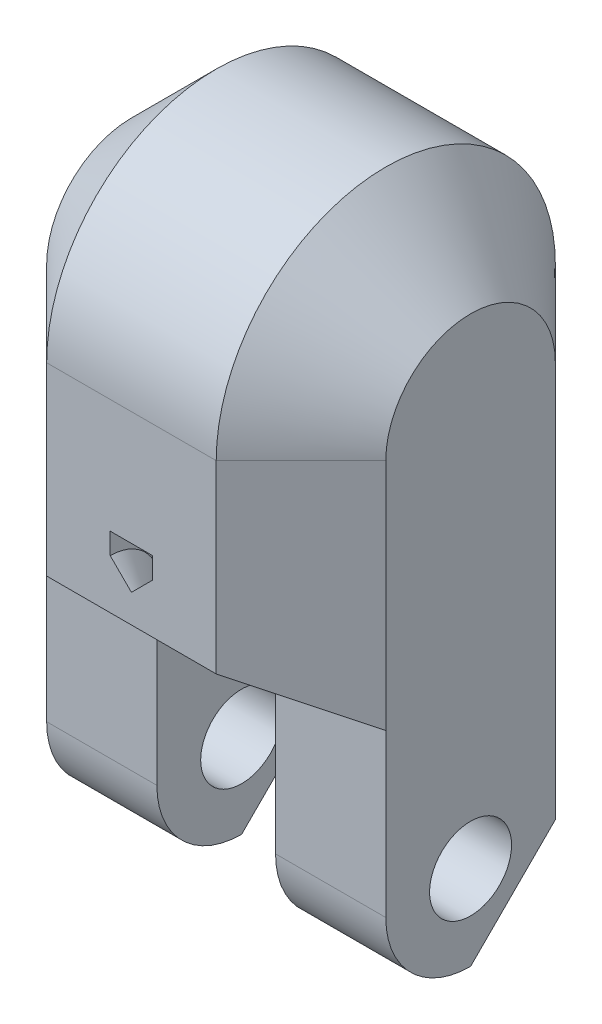
ISO-10303-21;
HEADER;
FILE_DESCRIPTION(('STEP AP214'),'2;1');
FILE_NAME('part.step','',(''),(''),'','','');
FILE_SCHEMA(('AUTOMOTIVE_DESIGN { 1 0 10303 214 1 1 1 1 }'));
ENDSEC;
DATA;
#1=APPLICATION_CONTEXT('core data for automotive mechanical design processes');
#2=APPLICATION_PROTOCOL_DEFINITION('international standard','automotive_design',2000,#1);
#3=PRODUCT_CONTEXT('',#1,'mechanical');
#4=PRODUCT('Part','Part','',(#3));
#5=PRODUCT_RELATED_PRODUCT_CATEGORY('part','',(#4));
#6=PRODUCT_DEFINITION_FORMATION('','',#4);
#7=PRODUCT_DEFINITION_CONTEXT('part definition',#1,'design');
#8=PRODUCT_DEFINITION('design','',#6,#7);
#9=PRODUCT_DEFINITION_SHAPE('','',#8);
#10=(LENGTH_UNIT() NAMED_UNIT(*) SI_UNIT(.MILLI.,.METRE.));
#11=(NAMED_UNIT(*) PLANE_ANGLE_UNIT() SI_UNIT($,.RADIAN.));
#12=(NAMED_UNIT(*) SI_UNIT($,.STERADIAN.) SOLID_ANGLE_UNIT());
#13=UNCERTAINTY_MEASURE_WITH_UNIT(LENGTH_MEASURE(1.E-05),#10,'distance_accuracy_value','');
#14=(GEOMETRIC_REPRESENTATION_CONTEXT(3) GLOBAL_UNCERTAINTY_ASSIGNED_CONTEXT((#13)) GLOBAL_UNIT_ASSIGNED_CONTEXT((#10,
#11,#12)) REPRESENTATION_CONTEXT('',''));
#15=CARTESIAN_POINT('',(0.,0.,0.));
#16=DIRECTION('',(0.,0.,1.));
#17=DIRECTION('',(1.,0.,0.));
#18=AXIS2_PLACEMENT_3D('',#15,#16,#17);
#19=CARTESIAN_POINT('',(-3.,5.,-6.));
#20=DIRECTION('',(0.,0.,-1.));
#21=DIRECTION('',(-1.,0.,0.));
#22=AXIS2_PLACEMENT_3D('',#19,#20,#21);
#23=PLANE('',#22);
#24=DIRECTION('',(0.,-1.,0.));
#25=VECTOR('',#24,1.);
#26=CARTESIAN_POINT('',(3.,5.,-6.));
#27=LINE('',#26,#25);
#28=CARTESIAN_POINT('',(3.,5.,-6.));
#29=VERTEX_POINT('',#28);
#30=CARTESIAN_POINT('',(3.,-8.7,-6.));
#31=VERTEX_POINT('',#30);
#32=EDGE_CURVE('E382',#29,#31,#27,.T.);
#33=ORIENTED_EDGE('',*,*,#32,.T.);
#34=DIRECTION('',(1.,0.,0.));
#35=VECTOR('',#34,1.);
#36=CARTESIAN_POINT('',(3.,-8.7,-6.));
#37=LINE('',#36,#35);
#38=CARTESIAN_POINT('',(-3.,-8.7,-6.));
#39=VERTEX_POINT('',#38);
#40=EDGE_CURVE('E488',#39,#31,#37,.T.);
#41=ORIENTED_EDGE('',*,*,#40,.F.);
#42=DIRECTION('',(0.,-1.,0.));
#43=VECTOR('',#42,1.);
#44=CARTESIAN_POINT('',(-3.,5.,-6.));
#45=LINE('',#44,#43);
#46=CARTESIAN_POINT('',(-3.,5.,-6.));
#47=VERTEX_POINT('',#46);
#48=EDGE_CURVE('E385',#47,#39,#45,.T.);
#49=ORIENTED_EDGE('',*,*,#48,.F.);
#50=DIRECTION('',(1.,0.,0.));
#51=VECTOR('',#50,1.);
#52=CARTESIAN_POINT('',(-3.,5.,-6.));
#53=LINE('',#52,#51);
#54=EDGE_CURVE('E343',#47,#29,#53,.T.);
#55=ORIENTED_EDGE('',*,*,#54,.T.);
#56=EDGE_LOOP('',(#33,#41,#49,#55));
#57=FACE_BOUND('',#56,.T.);
#58=DIRECTION('',(0.,1.,0.));
#59=VECTOR('',#58,1.);
#60=CARTESIAN_POINT('',(0.75,5.,-6.));
#61=LINE('',#60,#59);
#62=CARTESIAN_POINT('',(0.749999999999999,-7.7,-6.));
#63=VERTEX_POINT('',#62);
#64=CARTESIAN_POINT('',(0.75,-6.95,-6.));
#65=VERTEX_POINT('',#64);
#66=EDGE_CURVE('E461',#63,#65,#61,.T.);
#67=ORIENTED_EDGE('',*,*,#66,.T.);
#68=DIRECTION('',(0.707106781186548,-0.707106781186547,0.));
#69=VECTOR('',#68,1.);
#70=CARTESIAN_POINT('',(2.5,-8.7,-6.));
#71=LINE('',#70,#69);
#72=CARTESIAN_POINT('',(0.,-6.2,-6.));
#73=VERTEX_POINT('',#72);
#74=EDGE_CURVE('E479',#65,#73,#71,.F.);
#75=ORIENTED_EDGE('',*,*,#74,.T.);
#76=DIRECTION('',(0.707106781186547,0.707106781186548,0.));
#77=VECTOR('',#76,1.);
#78=CARTESIAN_POINT('',(-2.5,-8.7,-6.));
#79=LINE('',#78,#77);
#80=CARTESIAN_POINT('',(-0.75,-6.95,-6.));
#81=VERTEX_POINT('',#80);
#82=EDGE_CURVE('E476',#73,#81,#79,.F.);
#83=ORIENTED_EDGE('',*,*,#82,.T.);
#84=DIRECTION('',(0.,-1.,0.));
#85=VECTOR('',#84,1.);
#86=CARTESIAN_POINT('',(-0.75,5.,-6.));
#87=LINE('',#86,#85);
#88=CARTESIAN_POINT('',(-0.750000000000001,-7.7,-6.));
#89=VERTEX_POINT('',#88);
#90=EDGE_CURVE('E455',#81,#89,#87,.T.);
#91=ORIENTED_EDGE('',*,*,#90,.T.);
#92=DIRECTION('',(-1.,0.,0.));
#93=VECTOR('',#92,1.);
#94=CARTESIAN_POINT('',(-3.,-7.7,-6.));
#95=LINE('',#94,#93);
#96=EDGE_CURVE('E470',#89,#63,#95,.F.);
#97=ORIENTED_EDGE('',*,*,#96,.T.);
#98=EDGE_LOOP('',(#67,#75,#83,#91,#97));
#99=FACE_BOUND('',#98,.T.);
#100=ADVANCED_FACE('F38',(#57,#99),#23,.T.);
#101=CARTESIAN_POINT('',(0.,-8.7,0.));
#102=DIRECTION('',(0.,-1.,0.));
#103=DIRECTION('',(0.,0.,-1.));
#104=AXIS2_PLACEMENT_3D('',#101,#102,#103);
#105=PLANE('',#104);
#106=DIRECTION('',(0.707106781186548,0.,-0.707106781186548));
#107=VECTOR('',#106,1.);
#108=CARTESIAN_POINT('',(-3.,-8.7,-6.));
#109=LINE('',#108,#107);
#110=CARTESIAN_POINT('',(-6.,-8.7,-3.));
#111=VERTEX_POINT('',#110);
#112=EDGE_CURVE('E484',#111,#39,#109,.T.);
#113=ORIENTED_EDGE('',*,*,#112,.T.);
#114=ORIENTED_EDGE('',*,*,#40,.T.);
#115=DIRECTION('',(0.707106781186548,0.,0.707106781186548));
#116=VECTOR('',#115,1.);
#117=CARTESIAN_POINT('',(6.,-8.7,-3.));
#118=LINE('',#117,#116);
#119=CARTESIAN_POINT('',(6.,-8.7,-3.));
#120=VERTEX_POINT('',#119);
#121=EDGE_CURVE('E492',#31,#120,#118,.T.);
#122=ORIENTED_EDGE('',*,*,#121,.T.);
#123=DIRECTION('',(-1.,0.,0.));
#124=VECTOR('',#123,1.);
#125=CARTESIAN_POINT('',(2.1,-8.7,-3.));
#126=LINE('',#125,#124);
#127=CARTESIAN_POINT('',(2.1,-8.7,-3.));
#128=VERTEX_POINT('',#127);
#129=EDGE_CURVE('E248',#120,#128,#126,.T.);
#130=ORIENTED_EDGE('',*,*,#129,.T.);
#131=CARTESIAN_POINT('',(-2.1,-8.7,-3.));
#132=VERTEX_POINT('',#131);
#133=EDGE_CURVE('E499',#128,#132,#126,.T.);
#134=ORIENTED_EDGE('',*,*,#133,.T.);
#135=EDGE_CURVE('E495',#132,#111,#126,.T.);
#136=ORIENTED_EDGE('',*,*,#135,.T.);
#137=EDGE_LOOP('',(#113,#114,#122,#130,#134,#136));
#138=FACE_BOUND('',#137,.T.);
#139=DIRECTION('',(-0.707106781186547,0.,-0.707106781186548));
#140=VECTOR('',#139,1.);
#141=CARTESIAN_POINT('',(-2.5,-8.7,-6.));
#142=LINE('',#141,#140);
#143=CARTESIAN_POINT('',(-0.75,-8.7,-4.25));
#144=VERTEX_POINT('',#143);
#145=CARTESIAN_POINT('',(0.,-8.7,-3.5));
#146=VERTEX_POINT('',#145);
#147=EDGE_CURVE('E47',#144,#146,#142,.F.);
#148=ORIENTED_EDGE('',*,*,#147,.T.);
#149=DIRECTION('',(-0.707106781186548,0.,0.707106781186547));
#150=VECTOR('',#149,1.);
#151=CARTESIAN_POINT('',(2.5,-8.7,-6.));
#152=LINE('',#151,#150);
#153=CARTESIAN_POINT('',(0.75,-8.7,-4.25));
#154=VERTEX_POINT('',#153);
#155=EDGE_CURVE('E11',#146,#154,#152,.F.);
#156=ORIENTED_EDGE('',*,*,#155,.T.);
#157=DIRECTION('',(0.,0.,-1.));
#158=VECTOR('',#157,1.);
#159=CARTESIAN_POINT('',(0.75,-8.7,0.));
#160=LINE('',#159,#158);
#161=CARTESIAN_POINT('',(0.749999999999999,-8.7,-5.));
#162=VERTEX_POINT('',#161);
#163=EDGE_CURVE('E426',#154,#162,#160,.T.);
#164=ORIENTED_EDGE('',*,*,#163,.T.);
#165=DIRECTION('',(-1.,0.,0.));
#166=VECTOR('',#165,1.);
#167=CARTESIAN_POINT('',(-3.,-8.7,-5.));
#168=LINE('',#167,#166);
#169=CARTESIAN_POINT('',(-0.750000000000001,-8.7,-5.));
#170=VERTEX_POINT('',#169);
#171=EDGE_CURVE('E430',#162,#170,#168,.T.);
#172=ORIENTED_EDGE('',*,*,#171,.T.);
#173=DIRECTION('',(0.,0.,1.));
#174=VECTOR('',#173,1.);
#175=CARTESIAN_POINT('',(-0.75,-8.7,0.));
#176=LINE('',#175,#174);
#177=EDGE_CURVE('E434',#170,#144,#176,.T.);
#178=ORIENTED_EDGE('',*,*,#177,.T.);
#179=EDGE_LOOP('',(#148,#156,#164,#172,#178));
#180=FACE_BOUND('',#179,.T.);
#181=ADVANCED_FACE('F440',(#138,#180),#105,.T.);
#182=CARTESIAN_POINT('',(0.,-5.,0.));
#183=DIRECTION('',(0.,-1.,0.));
#184=DIRECTION('',(0.,0.,-1.));
#185=AXIS2_PLACEMENT_3D('',#182,#183,#184);
#186=PLANE('',#185);
#187=DIRECTION('',(0.,0.,-1.));
#188=VECTOR('',#187,1.);
#189=CARTESIAN_POINT('',(-2.1,-5.,0.));
#190=LINE('',#189,#188);
#191=CARTESIAN_POINT('',(-2.1,-5.,0.));
#192=VERTEX_POINT('',#191);
#193=CARTESIAN_POINT('',(-2.1,-5.,-3.));
#194=VERTEX_POINT('',#193);
#195=EDGE_CURVE('E308',#192,#194,#190,.T.);
#196=ORIENTED_EDGE('',*,*,#195,.T.);
#197=DIRECTION('',(-1.,0.,0.));
#198=VECTOR('',#197,1.);
#199=CARTESIAN_POINT('',(-6.,-5.,-3.));
#200=LINE('',#199,#198);
#201=CARTESIAN_POINT('',(2.1,-5.,-3.));
#202=VERTEX_POINT('',#201);
#203=EDGE_CURVE('E483',#202,#194,#200,.T.);
#204=ORIENTED_EDGE('',*,*,#203,.F.);
#205=DIRECTION('',(0.,0.,-1.));
#206=VECTOR('',#205,1.);
#207=CARTESIAN_POINT('',(2.1,-5.,0.));
#208=LINE('',#207,#206);
#209=CARTESIAN_POINT('',(2.1,-5.,0.));
#210=VERTEX_POINT('',#209);
#211=EDGE_CURVE('E270',#210,#202,#208,.T.);
#212=ORIENTED_EDGE('',*,*,#211,.F.);
#213=DIRECTION('',(1.,0.,0.));
#214=VECTOR('',#213,1.);
#215=CARTESIAN_POINT('',(-6.,-5.,0.));
#216=LINE('',#215,#214);
#217=EDGE_CURVE('E325',#192,#210,#216,.T.);
#218=ORIENTED_EDGE('',*,*,#217,.F.);
#219=EDGE_LOOP('',(#196,#204,#212,#218));
#220=FACE_BOUND('',#219,.T.);
#221=ADVANCED_FACE('F599',(#220),#186,.T.);
#222=CARTESIAN_POINT('',(-6.,-1.53589838486229,6.));
#223=DIRECTION('',(0.,0.866025403784442,-0.499999999999995));
#224=DIRECTION('',(0.,0.499999999999995,0.866025403784442));
#225=AXIS2_PLACEMENT_3D('',#222,#223,#224);
#226=PLANE('',#225);
#227=DIRECTION('',(-0.707106781186541,-0.353553390593273,-0.612372435695802));
#228=VECTOR('',#227,1.);
#229=CARTESIAN_POINT('',(0.999999999999979,-1.53589838486229,6.));
#230=LINE('',#229,#228);
#231=CARTESIAN_POINT('',(-0.749999999999986,-2.41089838486228,4.48445554337723));
#232=VERTEX_POINT('',#231);
#233=CARTESIAN_POINT('',(0.,-2.03589838486229,5.13397459621556));
#234=VERTEX_POINT('',#233);
#235=EDGE_CURVE('E537',#232,#234,#230,.F.);
#236=ORIENTED_EDGE('',*,*,#235,.T.);
#237=DIRECTION('',(-0.707106781186554,0.353553390593267,0.612372435695791));
#238=VECTOR('',#237,1.);
#239=CARTESIAN_POINT('',(-1.00000000000002,-1.53589838486229,6.));
#240=LINE('',#239,#238);
#241=CARTESIAN_POINT('',(0.750000000000014,-2.41089838486228,4.48445554337723));
#242=VERTEX_POINT('',#241);
#243=EDGE_CURVE('E410',#234,#242,#240,.F.);
#244=ORIENTED_EDGE('',*,*,#243,.T.);
#245=DIRECTION('',(0.,-0.499999999999995,-0.866025403784442));
#246=VECTOR('',#245,1.);
#247=CARTESIAN_POINT('',(0.750000000000014,-1.53589838486229,6.));
#248=LINE('',#247,#246);
#249=CARTESIAN_POINT('',(0.750000000000014,-2.78589838486228,3.8349364905389));
#250=VERTEX_POINT('',#249);
#251=EDGE_CURVE('E525',#242,#250,#248,.T.);
#252=ORIENTED_EDGE('',*,*,#251,.T.);
#253=DIRECTION('',(-1.,0.,0.));
#254=VECTOR('',#253,1.);
#255=CARTESIAN_POINT('',(-3.,-2.78589838486228,3.8349364905389));
#256=LINE('',#255,#254);
#257=CARTESIAN_POINT('',(-0.749999999999986,-2.78589838486228,3.8349364905389));
#258=VERTEX_POINT('',#257);
#259=EDGE_CURVE('E529',#250,#258,#256,.T.);
#260=ORIENTED_EDGE('',*,*,#259,.T.);
#261=DIRECTION('',(0.,0.499999999999995,0.866025403784442));
#262=VECTOR('',#261,1.);
#263=CARTESIAN_POINT('',(-0.749999999999986,-1.53589838486229,6.));
#264=LINE('',#263,#262);
#265=EDGE_CURVE('E533',#258,#232,#264,.T.);
#266=ORIENTED_EDGE('',*,*,#265,.T.);
#267=EDGE_LOOP('',(#236,#244,#252,#260,#266));
#268=FACE_BOUND('',#267,.T.);
#269=DIRECTION('',(0.,0.499999999999995,0.866025403784442));
#270=VECTOR('',#269,1.);
#271=CARTESIAN_POINT('',(2.1,-1.53589838486229,6.));
#272=LINE('',#271,#270);
#273=CARTESIAN_POINT('',(2.1,-3.26794919243115,3.));
#274=VERTEX_POINT('',#273);
#275=EDGE_CURVE('E397',#210,#274,#272,.T.);
#276=ORIENTED_EDGE('',*,*,#275,.T.);
#277=DIRECTION('',(1.,0.,0.));
#278=VECTOR('',#277,1.);
#279=CARTESIAN_POINT('',(-6.,-3.26794919243115,3.));
#280=LINE('',#279,#278);
#281=CARTESIAN_POINT('',(6.,-3.26794919243115,3.));
#282=VERTEX_POINT('',#281);
#283=EDGE_CURVE('E266',#274,#282,#280,.T.);
#284=ORIENTED_EDGE('',*,*,#283,.T.);
#285=DIRECTION('',(-0.654653670707978,0.377964473009223,0.654653670707978));
#286=VECTOR('',#285,1.);
#287=CARTESIAN_POINT('',(3.95421313204448,-2.08681359351244,5.04578686795552));
#288=LINE('',#287,#286);
#289=CARTESIAN_POINT('',(3.,-1.53589838486229,6.));
#290=VERTEX_POINT('',#289);
#291=EDGE_CURVE('E329',#282,#290,#288,.T.);
#292=ORIENTED_EDGE('',*,*,#291,.T.);
#293=DIRECTION('',(1.,0.,0.));
#294=VECTOR('',#293,1.);
#295=CARTESIAN_POINT('',(-6.,-1.53589838486229,6.));
#296=LINE('',#295,#294);
#297=CARTESIAN_POINT('',(-3.,-1.53589838486229,6.));
#298=VERTEX_POINT('',#297);
#299=EDGE_CURVE('E324',#298,#290,#296,.T.);
#300=ORIENTED_EDGE('',*,*,#299,.F.);
#301=DIRECTION('',(-0.654653670707978,-0.377964473009223,-0.654653670707979));
#302=VECTOR('',#301,1.);
#303=CARTESIAN_POINT('',(-1.38278456061589,-0.602198615596274,7.61721543938411));
#304=LINE('',#303,#302);
#305=CARTESIAN_POINT('',(-6.,-3.26794919243115,3.));
#306=VERTEX_POINT('',#305);
#307=EDGE_CURVE('E335',#298,#306,#304,.T.);
#308=ORIENTED_EDGE('',*,*,#307,.T.);
#309=DIRECTION('',(-1.,0.,0.));
#310=VECTOR('',#309,1.);
#311=CARTESIAN_POINT('',(-6.,-3.26794919243115,3.));
#312=LINE('',#311,#310);
#313=CARTESIAN_POINT('',(-2.1,-3.26794919243115,3.));
#314=VERTEX_POINT('',#313);
#315=EDGE_CURVE('E367',#314,#306,#312,.T.);
#316=ORIENTED_EDGE('',*,*,#315,.F.);
#317=DIRECTION('',(0.,0.499999999999995,0.866025403784442));
#318=VECTOR('',#317,1.);
#319=CARTESIAN_POINT('',(-2.1,-1.53589838486229,6.));
#320=LINE('',#319,#318);
#321=EDGE_CURVE('E393',#192,#314,#320,.T.);
#322=ORIENTED_EDGE('',*,*,#321,.F.);
#323=ORIENTED_EDGE('',*,*,#217,.T.);
#324=EDGE_LOOP('',(#276,#284,#292,#300,#308,#316,#322,#323));
#325=FACE_BOUND('',#324,.T.);
#326=ADVANCED_FACE('F569',(#268,#325),#226,.F.);
#327=CARTESIAN_POINT('',(-6.,5.,3.));
#328=DIRECTION('',(-1.,0.,0.));
#329=DIRECTION('',(0.,0.,1.));
#330=AXIS2_PLACEMENT_3D('',#327,#328,#329);
#331=PLANE('',#330);
#332=DIRECTION('',(0.,0.70710678118655,-0.707106781186545));
#333=VECTOR('',#332,1.);
#334=CARTESIAN_POINT('',(-6.,-4.99999999999994,-7.00000000000001));
#335=LINE('',#334,#333);
#336=CARTESIAN_POINT('',(-6.,-12.,0.));
#337=VERTEX_POINT('',#336);
#338=CARTESIAN_POINT('',(-6.,-8.99999999999998,-3.));
#339=VERTEX_POINT('',#338);
#340=EDGE_CURVE('E589',#337,#339,#335,.T.);
#341=ORIENTED_EDGE('',*,*,#340,.F.);
#342=CARTESIAN_POINT('',(-6.,-9.,0.));
#343=DIRECTION('',(-1.,0.,0.));
#344=DIRECTION('',(0.,0.,1.));
#345=AXIS2_PLACEMENT_3D('',#342,#343,#344);
#346=CIRCLE('',#345,3.);
#347=CARTESIAN_POINT('',(-6.,-9.,3.));
#348=VERTEX_POINT('',#347);
#349=EDGE_CURVE('E279',#337,#348,#346,.T.);
#350=ORIENTED_EDGE('',*,*,#349,.T.);
#351=DIRECTION('',(0.,1.,0.));
#352=VECTOR('',#351,1.);
#353=CARTESIAN_POINT('',(-6.,-9.,3.));
#354=LINE('',#353,#352);
#355=EDGE_CURVE('E292',#348,#306,#354,.T.);
#356=ORIENTED_EDGE('',*,*,#355,.T.);
#357=DIRECTION('',(0.,-1.,0.));
#358=VECTOR('',#357,1.);
#359=CARTESIAN_POINT('',(-6.,5.,3.));
#360=LINE('',#359,#358);
#361=CARTESIAN_POINT('',(-6.,4.99999999999998,3.));
#362=VERTEX_POINT('',#361);
#363=EDGE_CURVE('E364',#362,#306,#360,.T.);
#364=ORIENTED_EDGE('',*,*,#363,.F.);
#365=CARTESIAN_POINT('',(-6.,5.,0.));
#366=DIRECTION('',(-1.,0.,0.));
#367=DIRECTION('',(0.,0.,1.));
#368=AXIS2_PLACEMENT_3D('',#365,#366,#367);
#369=CIRCLE('',#368,3.);
#370=CARTESIAN_POINT('',(-6.,5.,-3.));
#371=VERTEX_POINT('',#370);
#372=EDGE_CURVE('E321',#362,#371,#369,.T.);
#373=ORIENTED_EDGE('',*,*,#372,.T.);
#374=DIRECTION('',(0.,-1.,0.));
#375=VECTOR('',#374,1.);
#376=CARTESIAN_POINT('',(-6.,5.,-3.));
#377=LINE('',#376,#375);
#378=EDGE_CURVE('E363',#371,#111,#377,.T.);
#379=ORIENTED_EDGE('',*,*,#378,.T.);
#380=DIRECTION('',(0.,1.,0.));
#381=VECTOR('',#380,1.);
#382=CARTESIAN_POINT('',(-6.,-9.,-3.));
#383=LINE('',#382,#381);
#384=EDGE_CURVE('E304',#339,#111,#383,.T.);
#385=ORIENTED_EDGE('',*,*,#384,.F.);
#386=EDGE_LOOP('',(#341,#350,#356,#364,#373,#379,#385));
#387=FACE_BOUND('',#386,.T.);
#388=CARTESIAN_POINT('',(-6.,-9.,0.));
#389=DIRECTION('',(-1.,0.,0.));
#390=DIRECTION('',(0.,0.,1.));
#391=AXIS2_PLACEMENT_3D('',#388,#389,#390);
#392=CIRCLE('',#391,1.45);
#393=CARTESIAN_POINT('',(-6.,-9.,1.45));
#394=VERTEX_POINT('',#393);
#395=EDGE_CURVE('E275',#394,#394,#392,.T.);
#396=ORIENTED_EDGE('',*,*,#395,.F.);
#397=EDGE_LOOP('',(#396));
#398=FACE_BOUND('',#397,.T.);
#399=ADVANCED_FACE('F40',(#387,#398),#331,.T.);
#400=CARTESIAN_POINT('',(-3.,5.,6.));
#401=DIRECTION('',(-0.707106781186548,0.,0.707106781186547));
#402=DIRECTION('',(0.707106781186547,0.,0.707106781186548));
#403=AXIS2_PLACEMENT_3D('',#400,#401,#402);
#404=PLANE('',#403);
#405=ORIENTED_EDGE('',*,*,#307,.F.);
#406=DIRECTION('',(0.,-1.,0.));
#407=VECTOR('',#406,1.);
#408=CARTESIAN_POINT('',(-3.,5.,6.));
#409=LINE('',#408,#407);
#410=CARTESIAN_POINT('',(-3.,4.99999999999996,6.));
#411=VERTEX_POINT('',#410);
#412=EDGE_CURVE('E368',#411,#298,#409,.T.);
#413=ORIENTED_EDGE('',*,*,#412,.F.);
#414=DIRECTION('',(-0.707106781186547,0.,-0.707106781186548));
#415=VECTOR('',#414,1.);
#416=CARTESIAN_POINT('',(-3.,5.,6.));
#417=LINE('',#416,#415);
#418=EDGE_CURVE('E359',#411,#362,#417,.T.);
#419=ORIENTED_EDGE('',*,*,#418,.T.);
#420=ORIENTED_EDGE('',*,*,#363,.T.);
#421=EDGE_LOOP('',(#405,#413,#419,#420));
#422=FACE_BOUND('',#421,.T.);
#423=ADVANCED_FACE('F576',(#422),#404,.T.);
#424=CARTESIAN_POINT('',(3.,5.,6.));
#425=DIRECTION('',(0.,0.,1.));
#426=DIRECTION('',(1.,0.,0.));
#427=AXIS2_PLACEMENT_3D('',#424,#425,#426);
#428=PLANE('',#427);
#429=DIRECTION('',(-0.707106781186554,-0.707106781186541,0.));
#430=VECTOR('',#429,1.);
#431=CARTESIAN_POINT('',(-1.00000000000002,-1.53589838486229,6.));
#432=LINE('',#431,#430);
#433=CARTESIAN_POINT('',(0.,-0.535898384862296,6.));
#434=VERTEX_POINT('',#433);
#435=CARTESIAN_POINT('',(0.750000000000014,0.214101615137704,6.));
#436=VERTEX_POINT('',#435);
#437=EDGE_CURVE('E422',#434,#436,#432,.F.);
#438=ORIENTED_EDGE('',*,*,#437,.F.);
#439=DIRECTION('',(-0.707106781186541,0.707106781186554,0.));
#440=VECTOR('',#439,1.);
#441=CARTESIAN_POINT('',(0.999999999999979,-1.53589838486229,6.));
#442=LINE('',#441,#440);
#443=CARTESIAN_POINT('',(-0.749999999999986,0.214101615137704,6.));
#444=VERTEX_POINT('',#443);
#445=EDGE_CURVE('E419',#444,#434,#442,.F.);
#446=ORIENTED_EDGE('',*,*,#445,.F.);
#447=DIRECTION('',(0.,-1.,0.));
#448=VECTOR('',#447,1.);
#449=CARTESIAN_POINT('',(-0.749999999999986,5.,6.));
#450=LINE('',#449,#448);
#451=CARTESIAN_POINT('',(-0.749999999999986,0.964101615137704,6.));
#452=VERTEX_POINT('',#451);
#453=EDGE_CURVE('E416',#452,#444,#450,.T.);
#454=ORIENTED_EDGE('',*,*,#453,.F.);
#455=DIRECTION('',(-1.,0.,0.));
#456=VECTOR('',#455,1.);
#457=CARTESIAN_POINT('',(-3.,0.964101615137704,6.));
#458=LINE('',#457,#456);
#459=CARTESIAN_POINT('',(0.750000000000014,0.964101615137704,6.));
#460=VERTEX_POINT('',#459);
#461=EDGE_CURVE('E413',#460,#452,#458,.T.);
#462=ORIENTED_EDGE('',*,*,#461,.F.);
#463=DIRECTION('',(0.,1.,0.));
#464=VECTOR('',#463,1.);
#465=CARTESIAN_POINT('',(0.750000000000014,5.,6.));
#466=LINE('',#465,#464);
#467=EDGE_CURVE('E404',#436,#460,#466,.T.);
#468=ORIENTED_EDGE('',*,*,#467,.F.);
#469=EDGE_LOOP('',(#438,#446,#454,#462,#468));
#470=FACE_BOUND('',#469,.T.);
#471=ORIENTED_EDGE('',*,*,#299,.T.);
#472=DIRECTION('',(0.,-1.,0.));
#473=VECTOR('',#472,1.);
#474=CARTESIAN_POINT('',(3.,5.,6.));
#475=LINE('',#474,#473);
#476=CARTESIAN_POINT('',(3.,4.99999999999996,6.));
#477=VERTEX_POINT('',#476);
#478=EDGE_CURVE('E372',#477,#290,#475,.T.);
#479=ORIENTED_EDGE('',*,*,#478,.F.);
#480=DIRECTION('',(-1.,0.,0.));
#481=VECTOR('',#480,1.);
#482=CARTESIAN_POINT('',(3.,5.,6.));
#483=LINE('',#482,#481);
#484=EDGE_CURVE('E355',#477,#411,#483,.T.);
#485=ORIENTED_EDGE('',*,*,#484,.T.);
#486=ORIENTED_EDGE('',*,*,#412,.T.);
#487=EDGE_LOOP('',(#471,#479,#485,#486));
#488=FACE_BOUND('',#487,.T.);
#489=ADVANCED_FACE('F572',(#470,#488),#428,.T.);
#490=CARTESIAN_POINT('',(6.,5.,3.));
#491=DIRECTION('',(0.707106781186548,0.,0.707106781186548));
#492=DIRECTION('',(0.707106781186548,0.,-0.707106781186548));
#493=AXIS2_PLACEMENT_3D('',#490,#491,#492);
#494=PLANE('',#493);
#495=ORIENTED_EDGE('',*,*,#291,.F.);
#496=DIRECTION('',(0.,-1.,0.));
#497=VECTOR('',#496,1.);
#498=CARTESIAN_POINT('',(6.,5.,3.));
#499=LINE('',#498,#497);
#500=CARTESIAN_POINT('',(6.,5.,3.));
#501=VERTEX_POINT('',#500);
#502=EDGE_CURVE('E376',#501,#282,#499,.T.);
#503=ORIENTED_EDGE('',*,*,#502,.F.);
#504=DIRECTION('',(-0.707106781186547,0.,0.707106781186547));
#505=VECTOR('',#504,1.);
#506=CARTESIAN_POINT('',(6.,5.,3.));
#507=LINE('',#506,#505);
#508=EDGE_CURVE('E351',#501,#477,#507,.T.);
#509=ORIENTED_EDGE('',*,*,#508,.T.);
#510=ORIENTED_EDGE('',*,*,#478,.T.);
#511=EDGE_LOOP('',(#495,#503,#509,#510));
#512=FACE_BOUND('',#511,.T.);
#513=ADVANCED_FACE('F566',(#512),#494,.T.);
#514=CARTESIAN_POINT('',(6.,5.,-3.));
#515=DIRECTION('',(1.,0.,0.));
#516=DIRECTION('',(0.,0.,-1.));
#517=AXIS2_PLACEMENT_3D('',#514,#515,#516);
#518=PLANE('',#517);
#519=DIRECTION('',(0.,0.70710678118655,-0.707106781186545));
#520=VECTOR('',#519,1.);
#521=CARTESIAN_POINT('',(6.,-8.99999999999998,-3.));
#522=LINE('',#521,#520);
#523=CARTESIAN_POINT('',(6.,-12.,0.));
#524=VERTEX_POINT('',#523);
#525=CARTESIAN_POINT('',(6.,-8.99999999999998,-3.));
#526=VERTEX_POINT('',#525);
#527=EDGE_CURVE('E62',#524,#526,#522,.T.);
#528=ORIENTED_EDGE('',*,*,#527,.T.);
#529=DIRECTION('',(0.,1.,0.));
#530=VECTOR('',#529,1.);
#531=CARTESIAN_POINT('',(6.,-9.,-3.));
#532=LINE('',#531,#530);
#533=EDGE_CURVE('E230',#526,#120,#532,.T.);
#534=ORIENTED_EDGE('',*,*,#533,.T.);
#535=DIRECTION('',(0.,-1.,0.));
#536=VECTOR('',#535,1.);
#537=CARTESIAN_POINT('',(6.,5.,-3.));
#538=LINE('',#537,#536);
#539=CARTESIAN_POINT('',(6.,5.,-3.));
#540=VERTEX_POINT('',#539);
#541=EDGE_CURVE('E379',#540,#120,#538,.T.);
#542=ORIENTED_EDGE('',*,*,#541,.F.);
#543=CARTESIAN_POINT('',(6.,5.,0.));
#544=DIRECTION('',(-1.,0.,0.));
#545=DIRECTION('',(0.,0.,1.));
#546=AXIS2_PLACEMENT_3D('',#543,#544,#545);
#547=CIRCLE('',#546,3.);
#548=EDGE_CURVE('E312',#501,#540,#547,.T.);
#549=ORIENTED_EDGE('',*,*,#548,.F.);
#550=ORIENTED_EDGE('',*,*,#502,.T.);
#551=DIRECTION('',(0.,1.,0.));
#552=VECTOR('',#551,1.);
#553=CARTESIAN_POINT('',(6.,-9.,3.));
#554=LINE('',#553,#552);
#555=CARTESIAN_POINT('',(6.,-9.,3.));
#556=VERTEX_POINT('',#555);
#557=EDGE_CURVE('E262',#556,#282,#554,.T.);
#558=ORIENTED_EDGE('',*,*,#557,.F.);
#559=CARTESIAN_POINT('',(6.,-9.,0.));
#560=DIRECTION('',(-1.,0.,0.));
#561=DIRECTION('',(0.,0.,1.));
#562=AXIS2_PLACEMENT_3D('',#559,#560,#561);
#563=CIRCLE('',#562,3.);
#564=EDGE_CURVE('E241',#524,#556,#563,.T.);
#565=ORIENTED_EDGE('',*,*,#564,.F.);
#566=EDGE_LOOP('',(#528,#534,#542,#549,#550,#558,#565));
#567=FACE_BOUND('',#566,.T.);
#568=CARTESIAN_POINT('',(6.,-9.,0.));
#569=DIRECTION('',(1.,0.,0.));
#570=DIRECTION('',(0.,0.,-1.));
#571=AXIS2_PLACEMENT_3D('',#568,#569,#570);
#572=CIRCLE('',#571,1.45);
#573=CARTESIAN_POINT('',(6.,-9.,-1.45));
#574=VERTEX_POINT('',#573);
#575=EDGE_CURVE('E409',#574,#574,#572,.F.);
#576=ORIENTED_EDGE('',*,*,#575,.T.);
#577=EDGE_LOOP('',(#576));
#578=FACE_BOUND('',#577,.T.);
#579=ADVANCED_FACE('F236',(#567,#578),#518,.T.);
#580=CARTESIAN_POINT('',(3.,5.,-6.));
#581=DIRECTION('',(0.707106781186547,0.,-0.707106781186548));
#582=DIRECTION('',(-0.707106781186548,0.,-0.707106781186547));
#583=AXIS2_PLACEMENT_3D('',#580,#581,#582);
#584=PLANE('',#583);
#585=ORIENTED_EDGE('',*,*,#541,.T.);
#586=ORIENTED_EDGE('',*,*,#121,.F.);
#587=ORIENTED_EDGE('',*,*,#32,.F.);
#588=DIRECTION('',(0.707106781186548,0.,0.707106781186547));
#589=VECTOR('',#588,1.);
#590=CARTESIAN_POINT('',(3.,5.,-6.));
#591=LINE('',#590,#589);
#592=EDGE_CURVE('E347',#29,#540,#591,.T.);
#593=ORIENTED_EDGE('',*,*,#592,.T.);
#594=EDGE_LOOP('',(#585,#586,#587,#593));
#595=FACE_BOUND('',#594,.T.);
#596=ADVANCED_FACE('F615',(#595),#584,.T.);
#597=CARTESIAN_POINT('',(-6.,5.,-3.));
#598=DIRECTION('',(-0.707106781186548,0.,-0.707106781186548));
#599=DIRECTION('',(-0.707106781186548,0.,0.707106781186548));
#600=AXIS2_PLACEMENT_3D('',#597,#598,#599);
#601=PLANE('',#600);
#602=ORIENTED_EDGE('',*,*,#48,.T.);
#603=ORIENTED_EDGE('',*,*,#112,.F.);
#604=ORIENTED_EDGE('',*,*,#378,.F.);
#605=DIRECTION('',(0.707106781186548,0.,-0.707106781186548));
#606=VECTOR('',#605,1.);
#607=CARTESIAN_POINT('',(-6.,5.,-3.));
#608=LINE('',#607,#606);
#609=EDGE_CURVE('E339',#371,#47,#608,.T.);
#610=ORIENTED_EDGE('',*,*,#609,.T.);
#611=EDGE_LOOP('',(#602,#603,#604,#610));
#612=FACE_BOUND('',#611,.T.);
#613=ADVANCED_FACE('F634',(#612),#601,.T.);
#614=CARTESIAN_POINT('',(-3.,5.,0.));
#615=DIRECTION('',(1.,0.,0.));
#616=DIRECTION('',(0.,0.,-1.));
#617=AXIS2_PLACEMENT_3D('',#614,#615,#616);
#618=CONICAL_SURFACE('',#617,6.,0.785398163397448);
#619=CARTESIAN_POINT('',(-3.,5.,0.));
#620=DIRECTION('',(-1.,0.,0.));
#621=DIRECTION('',(0.,0.,1.));
#622=AXIS2_PLACEMENT_3D('',#619,#620,#621);
#623=CIRCLE('',#622,6.);
#624=EDGE_CURVE('E318',#411,#47,#623,.T.);
#625=ORIENTED_EDGE('',*,*,#624,.T.);
#626=ORIENTED_EDGE('',*,*,#609,.F.);
#627=ORIENTED_EDGE('',*,*,#372,.F.);
#628=ORIENTED_EDGE('',*,*,#418,.F.);
#629=EDGE_LOOP('',(#625,#626,#627,#628));
#630=FACE_BOUND('',#629,.T.);
#631=ADVANCED_FACE('F625',(#630),#618,.T.);
#632=CARTESIAN_POINT('',(6.,5.,0.));
#633=DIRECTION('',(-1.,0.,0.));
#634=DIRECTION('',(0.,0.,1.));
#635=AXIS2_PLACEMENT_3D('',#632,#633,#634);
#636=CYLINDRICAL_SURFACE('',#635,6.);
#637=CARTESIAN_POINT('',(3.,5.,0.));
#638=DIRECTION('',(-1.,0.,0.));
#639=DIRECTION('',(0.,0.,1.));
#640=AXIS2_PLACEMENT_3D('',#637,#638,#639);
#641=CIRCLE('',#640,6.);
#642=EDGE_CURVE('E315',#477,#29,#641,.T.);
#643=ORIENTED_EDGE('',*,*,#642,.T.);
#644=ORIENTED_EDGE('',*,*,#54,.F.);
#645=ORIENTED_EDGE('',*,*,#624,.F.);
#646=ORIENTED_EDGE('',*,*,#484,.F.);
#647=EDGE_LOOP('',(#643,#644,#645,#646));
#648=FACE_BOUND('',#647,.T.);
#649=ADVANCED_FACE('F621',(#648),#636,.T.);
#650=CARTESIAN_POINT('',(6.,5.,0.));
#651=DIRECTION('',(-1.,0.,0.));
#652=DIRECTION('',(0.,0.,1.));
#653=AXIS2_PLACEMENT_3D('',#650,#651,#652);
#654=CONICAL_SURFACE('',#653,3.,0.785398163397448);
#655=ORIENTED_EDGE('',*,*,#548,.T.);
#656=ORIENTED_EDGE('',*,*,#592,.F.);
#657=ORIENTED_EDGE('',*,*,#642,.F.);
#658=ORIENTED_EDGE('',*,*,#508,.F.);
#659=EDGE_LOOP('',(#655,#656,#657,#658));
#660=FACE_BOUND('',#659,.T.);
#661=ADVANCED_FACE('F618',(#660),#654,.T.);
#662=CARTESIAN_POINT('',(-6.,-9.,3.));
#663=DIRECTION('',(0.,0.,-1.));
#664=DIRECTION('',(-1.,0.,0.));
#665=AXIS2_PLACEMENT_3D('',#662,#663,#664);
#666=PLANE('',#665);
#667=DIRECTION('',(0.,1.,0.));
#668=VECTOR('',#667,1.);
#669=CARTESIAN_POINT('',(-2.1,-9.,3.));
#670=LINE('',#669,#668);
#671=CARTESIAN_POINT('',(-2.1,-9.,3.));
#672=VERTEX_POINT('',#671);
#673=EDGE_CURVE('E296',#672,#314,#670,.T.);
#674=ORIENTED_EDGE('',*,*,#673,.T.);
#675=ORIENTED_EDGE('',*,*,#315,.T.);
#676=ORIENTED_EDGE('',*,*,#355,.F.);
#677=DIRECTION('',(-1.,0.,0.));
#678=VECTOR('',#677,1.);
#679=CARTESIAN_POINT('',(-6.,-9.,3.));
#680=LINE('',#679,#678);
#681=EDGE_CURVE('E288',#672,#348,#680,.T.);
#682=ORIENTED_EDGE('',*,*,#681,.F.);
#683=EDGE_LOOP('',(#674,#675,#676,#682));
#684=FACE_BOUND('',#683,.T.);
#685=ADVANCED_FACE('F581',(#684),#666,.F.);
#686=CARTESIAN_POINT('',(-6.,-9.,-3.));
#687=DIRECTION('',(0.,0.,1.));
#688=DIRECTION('',(1.,0.,0.));
#689=AXIS2_PLACEMENT_3D('',#686,#687,#688);
#690=PLANE('',#689);
#691=ORIENTED_EDGE('',*,*,#384,.T.);
#692=ORIENTED_EDGE('',*,*,#135,.F.);
#693=DIRECTION('',(0.,1.,0.));
#694=VECTOR('',#693,1.);
#695=CARTESIAN_POINT('',(-2.1,-9.,-3.));
#696=LINE('',#695,#694);
#697=CARTESIAN_POINT('',(-2.1,-8.99999999999998,-3.));
#698=VERTEX_POINT('',#697);
#699=EDGE_CURVE('E300',#698,#132,#696,.T.);
#700=ORIENTED_EDGE('',*,*,#699,.F.);
#701=DIRECTION('',(1.,0.,0.));
#702=VECTOR('',#701,1.);
#703=CARTESIAN_POINT('',(-6.,-9.,-3.));
#704=LINE('',#703,#702);
#705=EDGE_CURVE('E285',#339,#698,#704,.T.);
#706=ORIENTED_EDGE('',*,*,#705,.F.);
#707=EDGE_LOOP('',(#691,#692,#700,#706));
#708=FACE_BOUND('',#707,.T.);
#709=ADVANCED_FACE('F631',(#708),#690,.F.);
#710=CARTESIAN_POINT('',(-2.1,-9.,-3.));
#711=DIRECTION('',(-1.,0.,0.));
#712=DIRECTION('',(0.,0.,1.));
#713=AXIS2_PLACEMENT_3D('',#710,#711,#712);
#714=PLANE('',#713);
#715=CARTESIAN_POINT('',(-2.1,-9.,0.));
#716=DIRECTION('',(-1.,0.,0.));
#717=DIRECTION('',(0.,0.,1.));
#718=AXIS2_PLACEMENT_3D('',#715,#716,#717);
#719=CIRCLE('',#718,1.45);
#720=CARTESIAN_POINT('',(-2.1,-9.,1.45));
#721=VERTEX_POINT('',#720);
#722=EDGE_CURVE('E274',#721,#721,#719,.T.);
#723=ORIENTED_EDGE('',*,*,#722,.T.);
#724=EDGE_LOOP('',(#723));
#725=FACE_BOUND('',#724,.T.);
#726=CARTESIAN_POINT('',(-2.1,-9.,0.));
#727=DIRECTION('',(-1.,0.,0.));
#728=DIRECTION('',(0.,0.,1.));
#729=AXIS2_PLACEMENT_3D('',#726,#727,#728);
#730=CIRCLE('',#729,3.);
#731=CARTESIAN_POINT('',(-2.1,-12.,0.));
#732=VERTEX_POINT('',#731);
#733=EDGE_CURVE('E282',#732,#672,#730,.T.);
#734=ORIENTED_EDGE('',*,*,#733,.F.);
#735=DIRECTION('',(0.,0.70710678118655,-0.707106781186545));
#736=VECTOR('',#735,1.);
#737=CARTESIAN_POINT('',(-2.1,-9.,-3.));
#738=LINE('',#737,#736);
#739=EDGE_CURVE('E54',#732,#698,#738,.T.);
#740=ORIENTED_EDGE('',*,*,#739,.T.);
#741=ORIENTED_EDGE('',*,*,#699,.T.);
#742=DIRECTION('',(0.,-1.,0.));
#743=VECTOR('',#742,1.);
#744=CARTESIAN_POINT('',(-2.1,-9.,-3.));
#745=LINE('',#744,#743);
#746=EDGE_CURVE('E498',#194,#132,#745,.T.);
#747=ORIENTED_EDGE('',*,*,#746,.F.);
#748=ORIENTED_EDGE('',*,*,#195,.F.);
#749=ORIENTED_EDGE('',*,*,#321,.T.);
#750=ORIENTED_EDGE('',*,*,#673,.F.);
#751=EDGE_LOOP('',(#734,#740,#741,#747,#748,#749,#750));
#752=FACE_BOUND('',#751,.T.);
#753=ADVANCED_FACE('F594',(#725,#752),#714,.F.);
#754=CARTESIAN_POINT('',(-6.,-9.,0.));
#755=DIRECTION('',(-1.,0.,0.));
#756=DIRECTION('',(0.,0.,1.));
#757=AXIS2_PLACEMENT_3D('',#754,#755,#756);
#758=CYLINDRICAL_SURFACE('',#757,3.);
#759=ORIENTED_EDGE('',*,*,#349,.F.);
#760=DIRECTION('',(-1.,0.,0.));
#761=VECTOR('',#760,1.);
#762=CARTESIAN_POINT('',(6.,-12.,0.));
#763=LINE('',#762,#761);
#764=EDGE_CURVE('E243',#732,#337,#763,.T.);
#765=ORIENTED_EDGE('',*,*,#764,.F.);
#766=ORIENTED_EDGE('',*,*,#733,.T.);
#767=ORIENTED_EDGE('',*,*,#681,.T.);
#768=EDGE_LOOP('',(#759,#765,#766,#767));
#769=FACE_BOUND('',#768,.T.);
#770=ADVANCED_FACE('F591',(#769),#758,.T.);
#771=CARTESIAN_POINT('',(6.,-9.,0.));
#772=DIRECTION('',(-1.,0.,0.));
#773=DIRECTION('',(0.,0.,1.));
#774=AXIS2_PLACEMENT_3D('',#771,#772,#773);
#775=CYLINDRICAL_SURFACE('',#774,1.45);
#776=ORIENTED_EDGE('',*,*,#395,.T.);
#777=EDGE_LOOP('',(#776));
#778=FACE_BOUND('',#777,.T.);
#779=ORIENTED_EDGE('',*,*,#722,.F.);
#780=EDGE_LOOP('',(#779));
#781=FACE_BOUND('',#780,.T.);
#782=ADVANCED_FACE('F715',(#778,#781),#775,.F.);
#783=CARTESIAN_POINT('',(6.,-9.,3.));
#784=DIRECTION('',(0.,0.,1.));
#785=DIRECTION('',(1.,0.,0.));
#786=AXIS2_PLACEMENT_3D('',#783,#784,#785);
#787=PLANE('',#786);
#788=ORIENTED_EDGE('',*,*,#283,.F.);
#789=DIRECTION('',(0.,1.,0.));
#790=VECTOR('',#789,1.);
#791=CARTESIAN_POINT('',(2.1,-9.,3.));
#792=LINE('',#791,#790);
#793=CARTESIAN_POINT('',(2.1,-9.,3.));
#794=VERTEX_POINT('',#793);
#795=EDGE_CURVE('E259',#794,#274,#792,.T.);
#796=ORIENTED_EDGE('',*,*,#795,.F.);
#797=DIRECTION('',(1.,0.,0.));
#798=VECTOR('',#797,1.);
#799=CARTESIAN_POINT('',(6.,-9.,3.));
#800=LINE('',#799,#798);
#801=EDGE_CURVE('E231',#794,#556,#800,.T.);
#802=ORIENTED_EDGE('',*,*,#801,.T.);
#803=ORIENTED_EDGE('',*,*,#557,.T.);
#804=EDGE_LOOP('',(#788,#796,#802,#803));
#805=FACE_BOUND('',#804,.T.);
#806=ADVANCED_FACE('F557',(#805),#787,.T.);
#807=CARTESIAN_POINT('',(2.1,-9.,-3.));
#808=DIRECTION('',(-1.,0.,0.));
#809=DIRECTION('',(0.,0.,1.));
#810=AXIS2_PLACEMENT_3D('',#807,#808,#809);
#811=PLANE('',#810);
#812=DIRECTION('',(0.,0.70710678118655,-0.707106781186545));
#813=VECTOR('',#812,1.);
#814=CARTESIAN_POINT('',(2.1,-9.,-3.));
#815=LINE('',#814,#813);
#816=CARTESIAN_POINT('',(2.1,-12.,0.));
#817=VERTEX_POINT('',#816);
#818=CARTESIAN_POINT('',(2.1,-8.99999999999998,-3.));
#819=VERTEX_POINT('',#818);
#820=EDGE_CURVE('E225',#817,#819,#815,.T.);
#821=ORIENTED_EDGE('',*,*,#820,.F.);
#822=CARTESIAN_POINT('',(2.1,-9.,0.));
#823=DIRECTION('',(-1.,0.,0.));
#824=DIRECTION('',(0.,0.,1.));
#825=AXIS2_PLACEMENT_3D('',#822,#823,#824);
#826=CIRCLE('',#825,3.);
#827=EDGE_CURVE('E549',#817,#794,#826,.T.);
#828=ORIENTED_EDGE('',*,*,#827,.T.);
#829=ORIENTED_EDGE('',*,*,#795,.T.);
#830=ORIENTED_EDGE('',*,*,#275,.F.);
#831=ORIENTED_EDGE('',*,*,#211,.T.);
#832=DIRECTION('',(0.,1.,0.));
#833=VECTOR('',#832,1.);
#834=CARTESIAN_POINT('',(2.1,-9.,-3.));
#835=LINE('',#834,#833);
#836=EDGE_CURVE('E250',#128,#202,#835,.T.);
#837=ORIENTED_EDGE('',*,*,#836,.F.);
#838=EDGE_CURVE('E254',#819,#128,#835,.T.);
#839=ORIENTED_EDGE('',*,*,#838,.F.);
#840=EDGE_LOOP('',(#821,#828,#829,#830,#831,#837,#839));
#841=FACE_BOUND('',#840,.T.);
#842=CARTESIAN_POINT('',(2.1,-9.,0.));
#843=DIRECTION('',(-1.,0.,0.));
#844=DIRECTION('',(0.,0.,1.));
#845=AXIS2_PLACEMENT_3D('',#842,#843,#844);
#846=CIRCLE('',#845,1.45);
#847=CARTESIAN_POINT('',(2.1,-9.,1.45));
#848=VERTEX_POINT('',#847);
#849=EDGE_CURVE('E405',#848,#848,#846,.F.);
#850=ORIENTED_EDGE('',*,*,#849,.T.);
#851=EDGE_LOOP('',(#850));
#852=FACE_BOUND('',#851,.T.);
#853=ADVANCED_FACE('F602',(#841,#852),#811,.T.);
#854=CARTESIAN_POINT('',(6.,-9.,-3.));
#855=DIRECTION('',(0.,0.,-1.));
#856=DIRECTION('',(-1.,0.,0.));
#857=AXIS2_PLACEMENT_3D('',#854,#855,#856);
#858=PLANE('',#857);
#859=ORIENTED_EDGE('',*,*,#129,.F.);
#860=ORIENTED_EDGE('',*,*,#533,.F.);
#861=DIRECTION('',(-1.,0.,0.));
#862=VECTOR('',#861,1.);
#863=CARTESIAN_POINT('',(6.,-9.,-3.));
#864=LINE('',#863,#862);
#865=EDGE_CURVE('E222',#526,#819,#864,.T.);
#866=ORIENTED_EDGE('',*,*,#865,.T.);
#867=ORIENTED_EDGE('',*,*,#838,.T.);
#868=EDGE_LOOP('',(#859,#860,#866,#867));
#869=FACE_BOUND('',#868,.T.);
#870=ADVANCED_FACE('F246',(#869),#858,.T.);
#871=CARTESIAN_POINT('',(6.,-9.,0.));
#872=DIRECTION('',(1.,0.,0.));
#873=DIRECTION('',(0.,0.,1.));
#874=AXIS2_PLACEMENT_3D('',#871,#872,#873);
#875=CYLINDRICAL_SURFACE('',#874,3.);
#876=ORIENTED_EDGE('',*,*,#827,.F.);
#877=EDGE_CURVE('E561',#524,#817,#763,.T.);
#878=ORIENTED_EDGE('',*,*,#877,.F.);
#879=ORIENTED_EDGE('',*,*,#564,.T.);
#880=ORIENTED_EDGE('',*,*,#801,.F.);
#881=EDGE_LOOP('',(#876,#878,#879,#880));
#882=FACE_BOUND('',#881,.T.);
#883=ADVANCED_FACE('F560',(#882),#875,.T.);
#884=CARTESIAN_POINT('',(-6.,-9.,0.));
#885=DIRECTION('',(1.,0.,0.));
#886=DIRECTION('',(0.,0.,-1.));
#887=AXIS2_PLACEMENT_3D('',#884,#885,#886);
#888=CYLINDRICAL_SURFACE('',#887,1.45);
#889=ORIENTED_EDGE('',*,*,#575,.F.);
#890=EDGE_LOOP('',(#889));
#891=FACE_BOUND('',#890,.T.);
#892=ORIENTED_EDGE('',*,*,#849,.F.);
#893=EDGE_LOOP('',(#892));
#894=FACE_BOUND('',#893,.T.);
#895=ADVANCED_FACE('F702',(#891,#894),#888,.F.);
#896=CARTESIAN_POINT('',(0.750000000000014,-1.53589838486229,6.));
#897=DIRECTION('',(1.,0.,0.));
#898=DIRECTION('',(0.,0.,-1.));
#899=AXIS2_PLACEMENT_3D('',#896,#897,#898);
#900=CONICAL_SURFACE('',#899,1.75,0.785398163397439);
#901=CARTESIAN_POINT('',(0.,-1.53589838486229,6.));
#902=DIRECTION('',(-1.,0.,0.));
#903=DIRECTION('',(0.,0.,1.));
#904=AXIS2_PLACEMENT_3D('',#901,#902,#903);
#905=CIRCLE('',#904,0.999999999999998);
#906=EDGE_CURVE('E521',#434,#234,#905,.T.);
#907=ORIENTED_EDGE('',*,*,#906,.F.);
#908=ORIENTED_EDGE('',*,*,#437,.T.);
#909=CARTESIAN_POINT('',(0.750000000000014,-1.53589838486229,6.));
#910=DIRECTION('',(-1.,0.,0.));
#911=DIRECTION('',(0.,0.,1.));
#912=AXIS2_PLACEMENT_3D('',#909,#910,#911);
#913=CIRCLE('',#912,1.75);
#914=EDGE_CURVE('E506',#436,#242,#913,.T.);
#915=ORIENTED_EDGE('',*,*,#914,.T.);
#916=ORIENTED_EDGE('',*,*,#243,.F.);
#917=EDGE_LOOP('',(#907,#908,#915,#916));
#918=FACE_BOUND('',#917,.T.);
#919=ADVANCED_FACE('F698',(#918),#900,.T.);
#920=CARTESIAN_POINT('',(0.,-1.53589838486229,6.));
#921=DIRECTION('',(-1.,0.,0.));
#922=DIRECTION('',(0.,0.,1.));
#923=AXIS2_PLACEMENT_3D('',#920,#921,#922);
#924=CONICAL_SURFACE('',#923,0.999999999999998,0.785398163397458);
#925=CARTESIAN_POINT('',(-0.749999999999986,-1.53589838486229,6.));
#926=DIRECTION('',(-1.,0.,0.));
#927=DIRECTION('',(0.,0.,1.));
#928=AXIS2_PLACEMENT_3D('',#925,#926,#927);
#929=CIRCLE('',#928,1.75);
#930=EDGE_CURVE('E517',#444,#232,#929,.T.);
#931=ORIENTED_EDGE('',*,*,#930,.F.);
#932=ORIENTED_EDGE('',*,*,#445,.T.);
#933=ORIENTED_EDGE('',*,*,#906,.T.);
#934=ORIENTED_EDGE('',*,*,#235,.F.);
#935=EDGE_LOOP('',(#931,#932,#933,#934));
#936=FACE_BOUND('',#935,.T.);
#937=ADVANCED_FACE('F694',(#936),#924,.T.);
#938=CARTESIAN_POINT('',(-0.749999999999986,-2.41089838486228,4.48445554337723));
#939=DIRECTION('',(-1.,0.,0.));
#940=DIRECTION('',(0.,0.,1.));
#941=AXIS2_PLACEMENT_3D('',#938,#939,#940);
#942=PLANE('',#941);
#943=CARTESIAN_POINT('',(-0.749999999999986,-1.53589838486229,6.));
#944=DIRECTION('',(-1.,0.,0.));
#945=DIRECTION('',(0.,0.,1.));
#946=AXIS2_PLACEMENT_3D('',#943,#944,#945);
#947=CIRCLE('',#946,2.5);
#948=EDGE_CURVE('E513',#452,#258,#947,.T.);
#949=ORIENTED_EDGE('',*,*,#948,.F.);
#950=ORIENTED_EDGE('',*,*,#453,.T.);
#951=ORIENTED_EDGE('',*,*,#930,.T.);
#952=ORIENTED_EDGE('',*,*,#265,.F.);
#953=EDGE_LOOP('',(#949,#950,#951,#952));
#954=FACE_BOUND('',#953,.T.);
#955=ADVANCED_FACE('F690',(#954),#942,.F.);
#956=CARTESIAN_POINT('',(-3.,-1.53589838486229,6.));
#957=DIRECTION('',(-1.,0.,0.));
#958=DIRECTION('',(0.,0.,1.));
#959=AXIS2_PLACEMENT_3D('',#956,#957,#958);
#960=CYLINDRICAL_SURFACE('',#959,2.5);
#961=CARTESIAN_POINT('',(0.750000000000014,-1.53589838486229,6.));
#962=DIRECTION('',(-1.,0.,0.));
#963=DIRECTION('',(0.,0.,1.));
#964=AXIS2_PLACEMENT_3D('',#961,#962,#963);
#965=CIRCLE('',#964,2.5);
#966=EDGE_CURVE('E510',#460,#250,#965,.T.);
#967=ORIENTED_EDGE('',*,*,#966,.F.);
#968=ORIENTED_EDGE('',*,*,#461,.T.);
#969=ORIENTED_EDGE('',*,*,#948,.T.);
#970=ORIENTED_EDGE('',*,*,#259,.F.);
#971=EDGE_LOOP('',(#967,#968,#969,#970));
#972=FACE_BOUND('',#971,.T.);
#973=ADVANCED_FACE('F686',(#972),#960,.F.);
#974=CARTESIAN_POINT('',(0.750000000000014,-2.78589838486228,3.8349364905389));
#975=DIRECTION('',(1.,0.,0.));
#976=DIRECTION('',(0.,0.,-1.));
#977=AXIS2_PLACEMENT_3D('',#974,#975,#976);
#978=PLANE('',#977);
#979=ORIENTED_EDGE('',*,*,#914,.F.);
#980=ORIENTED_EDGE('',*,*,#467,.T.);
#981=ORIENTED_EDGE('',*,*,#966,.T.);
#982=ORIENTED_EDGE('',*,*,#251,.F.);
#983=EDGE_LOOP('',(#979,#980,#981,#982));
#984=FACE_BOUND('',#983,.T.);
#985=ADVANCED_FACE('F683',(#984),#978,.F.);
#986=CARTESIAN_POINT('',(-6.,-8.7,-3.));
#987=DIRECTION('',(0.,0.,-1.));
#988=DIRECTION('',(-1.,0.,0.));
#989=AXIS2_PLACEMENT_3D('',#986,#987,#988);
#990=PLANE('',#989);
#991=ORIENTED_EDGE('',*,*,#203,.T.);
#992=ORIENTED_EDGE('',*,*,#746,.T.);
#993=ORIENTED_EDGE('',*,*,#133,.F.);
#994=ORIENTED_EDGE('',*,*,#836,.T.);
#995=EDGE_LOOP('',(#991,#992,#993,#994));
#996=FACE_BOUND('',#995,.T.);
#997=ADVANCED_FACE('F606',(#996),#990,.F.);
#998=CARTESIAN_POINT('',(0.75,-8.7,-6.));
#999=DIRECTION('',(-1.,0.,0.));
#1000=DIRECTION('',(0.,0.,1.));
#1001=AXIS2_PLACEMENT_3D('',#998,#999,#1000);
#1002=CONICAL_SURFACE('',#1001,1.75,0.785398163397448);
#1003=CARTESIAN_POINT('',(0.75,-8.7,-6.));
#1004=DIRECTION('',(-1.,0.,0.));
#1005=DIRECTION('',(0.,0.,1.));
#1006=AXIS2_PLACEMENT_3D('',#1003,#1004,#1005);
#1007=CIRCLE('',#1006,1.75);
#1008=EDGE_CURVE('E645',#154,#65,#1007,.T.);
#1009=ORIENTED_EDGE('',*,*,#1008,.F.);
#1010=ORIENTED_EDGE('',*,*,#155,.F.);
#1011=CARTESIAN_POINT('',(0.,-8.7,-6.));
#1012=DIRECTION('',(-1.,0.,0.));
#1013=DIRECTION('',(0.,0.,1.));
#1014=AXIS2_PLACEMENT_3D('',#1011,#1012,#1013);
#1015=CIRCLE('',#1014,2.5);
#1016=EDGE_CURVE('E449',#146,#73,#1015,.T.);
#1017=ORIENTED_EDGE('',*,*,#1016,.T.);
#1018=ORIENTED_EDGE('',*,*,#74,.F.);
#1019=EDGE_LOOP('',(#1009,#1010,#1017,#1018));
#1020=FACE_BOUND('',#1019,.T.);
#1021=ADVANCED_FACE('F675',(#1020),#1002,.F.);
#1022=CARTESIAN_POINT('',(0.,-8.7,-6.));
#1023=DIRECTION('',(1.,0.,0.));
#1024=DIRECTION('',(0.,0.,-1.));
#1025=AXIS2_PLACEMENT_3D('',#1022,#1023,#1024);
#1026=CONICAL_SURFACE('',#1025,2.5,0.785398163397449);
#1027=ORIENTED_EDGE('',*,*,#1016,.F.);
#1028=ORIENTED_EDGE('',*,*,#147,.F.);
#1029=CARTESIAN_POINT('',(-0.75,-8.7,-6.));
#1030=DIRECTION('',(-1.,0.,0.));
#1031=DIRECTION('',(0.,0.,1.));
#1032=AXIS2_PLACEMENT_3D('',#1029,#1030,#1031);
#1033=CIRCLE('',#1032,1.75);
#1034=EDGE_CURVE('E446',#144,#81,#1033,.T.);
#1035=ORIENTED_EDGE('',*,*,#1034,.T.);
#1036=ORIENTED_EDGE('',*,*,#82,.F.);
#1037=EDGE_LOOP('',(#1027,#1028,#1035,#1036));
#1038=FACE_BOUND('',#1037,.T.);
#1039=ADVANCED_FACE('F445',(#1038),#1026,.F.);
#1040=CARTESIAN_POINT('',(-0.75,-8.7,-4.25));
#1041=DIRECTION('',(1.,0.,0.));
#1042=DIRECTION('',(0.,0.,-1.));
#1043=AXIS2_PLACEMENT_3D('',#1040,#1041,#1042);
#1044=PLANE('',#1043);
#1045=ORIENTED_EDGE('',*,*,#1034,.F.);
#1046=ORIENTED_EDGE('',*,*,#177,.F.);
#1047=CARTESIAN_POINT('',(-0.750000000000001,-8.7,-6.));
#1048=DIRECTION('',(-1.,0.,0.));
#1049=DIRECTION('',(0.,0.,1.));
#1050=AXIS2_PLACEMENT_3D('',#1047,#1048,#1049);
#1051=CIRCLE('',#1050,1.);
#1052=EDGE_CURVE('E457',#170,#89,#1051,.T.);
#1053=ORIENTED_EDGE('',*,*,#1052,.T.);
#1054=ORIENTED_EDGE('',*,*,#90,.F.);
#1055=EDGE_LOOP('',(#1045,#1046,#1053,#1054));
#1056=FACE_BOUND('',#1055,.T.);
#1057=ADVANCED_FACE('F451',(#1056),#1044,.T.);
#1058=CARTESIAN_POINT('',(-3.,-8.7,-6.));
#1059=DIRECTION('',(-1.,0.,0.));
#1060=DIRECTION('',(0.,0.,1.));
#1061=AXIS2_PLACEMENT_3D('',#1058,#1059,#1060);
#1062=CYLINDRICAL_SURFACE('',#1061,1.);
#1063=ORIENTED_EDGE('',*,*,#1052,.F.);
#1064=ORIENTED_EDGE('',*,*,#171,.F.);
#1065=CARTESIAN_POINT('',(0.749999999999999,-8.7,-6.));
#1066=DIRECTION('',(-1.,0.,0.));
#1067=DIRECTION('',(0.,0.,1.));
#1068=AXIS2_PLACEMENT_3D('',#1065,#1066,#1067);
#1069=CIRCLE('',#1068,1.);
#1070=EDGE_CURVE('E463',#162,#63,#1069,.T.);
#1071=ORIENTED_EDGE('',*,*,#1070,.T.);
#1072=ORIENTED_EDGE('',*,*,#96,.F.);
#1073=EDGE_LOOP('',(#1063,#1064,#1071,#1072));
#1074=FACE_BOUND('',#1073,.T.);
#1075=ADVANCED_FACE('F647',(#1074),#1062,.T.);
#1076=CARTESIAN_POINT('',(0.75,-8.7,-5.));
#1077=DIRECTION('',(-1.,0.,0.));
#1078=DIRECTION('',(0.,0.,1.));
#1079=AXIS2_PLACEMENT_3D('',#1076,#1077,#1078);
#1080=PLANE('',#1079);
#1081=ORIENTED_EDGE('',*,*,#1070,.F.);
#1082=ORIENTED_EDGE('',*,*,#163,.F.);
#1083=ORIENTED_EDGE('',*,*,#1008,.T.);
#1084=ORIENTED_EDGE('',*,*,#66,.F.);
#1085=EDGE_LOOP('',(#1081,#1082,#1083,#1084));
#1086=FACE_BOUND('',#1085,.T.);
#1087=ADVANCED_FACE('F642',(#1086),#1080,.T.);
#1088=CARTESIAN_POINT('',(6.,-8.99999999999998,-3.));
#1089=DIRECTION('',(0.,0.707106781186545,0.70710678118655));
#1090=DIRECTION('',(0.,-0.70710678118655,0.707106781186545));
#1091=AXIS2_PLACEMENT_3D('',#1088,#1089,#1090);
#1092=PLANE('',#1091);
#1093=ORIENTED_EDGE('',*,*,#820,.T.);
#1094=ORIENTED_EDGE('',*,*,#865,.F.);
#1095=ORIENTED_EDGE('',*,*,#527,.F.);
#1096=ORIENTED_EDGE('',*,*,#877,.T.);
#1097=EDGE_LOOP('',(#1093,#1094,#1095,#1096));
#1098=FACE_BOUND('',#1097,.T.);
#1099=ADVANCED_FACE('F223',(#1098),#1092,.F.);
#1100=ORIENTED_EDGE('',*,*,#340,.T.);
#1101=ORIENTED_EDGE('',*,*,#705,.T.);
#1102=ORIENTED_EDGE('',*,*,#739,.F.);
#1103=ORIENTED_EDGE('',*,*,#764,.T.);
#1104=EDGE_LOOP('',(#1100,#1101,#1102,#1103));
#1105=FACE_BOUND('',#1104,.T.);
#1106=ADVANCED_FACE('F660',(#1105),#1092,.F.);
#1107=CLOSED_SHELL('',(#100,#181,#221,#326,#399,#423,#489,#513,#579,#596,#613,#631,#649,#661,
#685,#709,#753,#770,#782,#806,#853,#870,#883,#895,#919,#937,#955,#973,#985,#997,#1021,#1039,
#1057,#1075,#1087,#1099,#1106));
#1108=MANIFOLD_SOLID_BREP('B2',#1107);
#1109=ADVANCED_BREP_SHAPE_REPRESENTATION('',(#18,#1108),#14);
#1110=SHAPE_DEFINITION_REPRESENTATION(#9,#1109);
ENDSEC;
END-ISO-10303-21;
